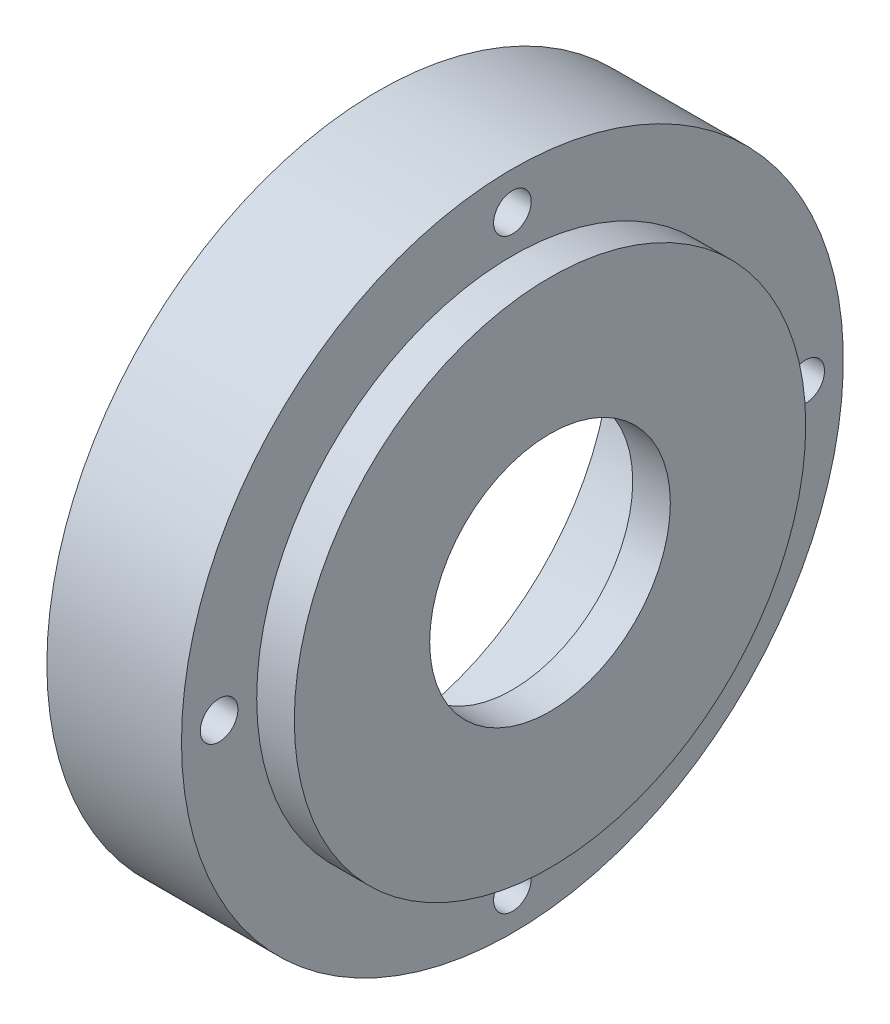
ISO-10303-21;
HEADER;
FILE_DESCRIPTION(('STEP AP214'),'2;1');
FILE_NAME('part.step','',(''),(''),'','','');
FILE_SCHEMA(('AUTOMOTIVE_DESIGN { 1 0 10303 214 1 1 1 1 }'));
ENDSEC;
DATA;
#1=APPLICATION_CONTEXT('core data for automotive mechanical design processes');
#2=APPLICATION_PROTOCOL_DEFINITION('international standard','automotive_design',2000,#1);
#3=PRODUCT_CONTEXT('',#1,'mechanical');
#4=PRODUCT('Part','Part','',(#3));
#5=PRODUCT_RELATED_PRODUCT_CATEGORY('part','',(#4));
#6=PRODUCT_DEFINITION_FORMATION('','',#4);
#7=PRODUCT_DEFINITION_CONTEXT('part definition',#1,'design');
#8=PRODUCT_DEFINITION('design','',#6,#7);
#9=PRODUCT_DEFINITION_SHAPE('','',#8);
#10=(LENGTH_UNIT() NAMED_UNIT(*) SI_UNIT(.MILLI.,.METRE.));
#11=(NAMED_UNIT(*) PLANE_ANGLE_UNIT() SI_UNIT($,.RADIAN.));
#12=(NAMED_UNIT(*) SI_UNIT($,.STERADIAN.) SOLID_ANGLE_UNIT());
#13=UNCERTAINTY_MEASURE_WITH_UNIT(LENGTH_MEASURE(1.E-05),#10,'distance_accuracy_value','');
#14=(GEOMETRIC_REPRESENTATION_CONTEXT(3) GLOBAL_UNCERTAINTY_ASSIGNED_CONTEXT((#13)) GLOBAL_UNIT_ASSIGNED_CONTEXT((#10,
#11,#12)) REPRESENTATION_CONTEXT('',''));
#15=CARTESIAN_POINT('',(0.,0.,0.));
#16=DIRECTION('',(0.,0.,1.));
#17=DIRECTION('',(1.,0.,0.));
#18=AXIS2_PLACEMENT_3D('',#15,#16,#17);
#19=CARTESIAN_POINT('',(17.9,0.,0.));
#20=DIRECTION('',(1.,0.,0.));
#21=DIRECTION('',(0.,0.,-1.));
#22=AXIS2_PLACEMENT_3D('',#19,#20,#21);
#23=PLANE('',#22);
#24=CARTESIAN_POINT('',(17.9,0.,0.));
#25=DIRECTION('',(1.,0.,0.));
#26=DIRECTION('',(0.,0.,-1.));
#27=AXIS2_PLACEMENT_3D('',#24,#25,#26);
#28=CIRCLE('',#27,34.);
#29=CARTESIAN_POINT('',(17.9,0.,-34.));
#30=VERTEX_POINT('',#29);
#31=EDGE_CURVE('E92',#30,#30,#28,.T.);
#32=ORIENTED_EDGE('',*,*,#31,.F.);
#33=EDGE_LOOP('',(#32));
#34=FACE_BOUND('',#33,.T.);
#35=CARTESIAN_POINT('',(17.9,39.,0.));
#36=DIRECTION('',(1.,0.,0.));
#37=DIRECTION('',(0.,0.,-1.));
#38=AXIS2_PLACEMENT_3D('',#35,#36,#37);
#39=CIRCLE('',#38,2.5);
#40=CARTESIAN_POINT('',(17.9,39.,-2.5));
#41=VERTEX_POINT('',#40);
#42=EDGE_CURVE('E78',#41,#41,#39,.T.);
#43=ORIENTED_EDGE('',*,*,#42,.F.);
#44=EDGE_LOOP('',(#43));
#45=FACE_BOUND('',#44,.T.);
#46=CARTESIAN_POINT('',(17.9,1.10128248401074E-12,-39.0000000000011));
#47=DIRECTION('',(1.,0.,0.));
#48=DIRECTION('',(0.,0.,-1.));
#49=AXIS2_PLACEMENT_3D('',#46,#47,#48);
#50=CIRCLE('',#49,2.50000000000086);
#51=CARTESIAN_POINT('',(17.9,1.10128248401074E-12,-41.500000000002));
#52=VERTEX_POINT('',#51);
#53=EDGE_CURVE('E70',#52,#52,#50,.T.);
#54=ORIENTED_EDGE('',*,*,#53,.F.);
#55=EDGE_LOOP('',(#54));
#56=FACE_BOUND('',#55,.T.);
#57=CARTESIAN_POINT('',(17.9,-39.,-2.20256496802149E-12));
#58=DIRECTION('',(1.,0.,0.));
#59=DIRECTION('',(0.,0.,-1.));
#60=AXIS2_PLACEMENT_3D('',#57,#58,#59);
#61=CIRCLE('',#60,2.50000000000237);
#62=CARTESIAN_POINT('',(17.9,-39.,-2.50000000000457));
#63=VERTEX_POINT('',#62);
#64=EDGE_CURVE('E60',#63,#63,#61,.T.);
#65=ORIENTED_EDGE('',*,*,#64,.F.);
#66=EDGE_LOOP('',(#65));
#67=FACE_BOUND('',#66,.T.);
#68=CARTESIAN_POINT('',(17.9,-1.10605860652742E-12,38.9999999999989));
#69=DIRECTION('',(1.,0.,0.));
#70=DIRECTION('',(0.,0.,-1.));
#71=AXIS2_PLACEMENT_3D('',#68,#69,#70);
#72=CIRCLE('',#71,2.50000000000177);
#73=CARTESIAN_POINT('',(17.9,-1.10605860652742E-12,36.4999999999971));
#74=VERTEX_POINT('',#73);
#75=EDGE_CURVE('E61',#74,#74,#72,.T.);
#76=ORIENTED_EDGE('',*,*,#75,.F.);
#77=EDGE_LOOP('',(#76));
#78=FACE_BOUND('',#77,.T.);
#79=CARTESIAN_POINT('',(17.9,0.,0.));
#80=DIRECTION('',(1.,0.,0.));
#81=DIRECTION('',(0.,0.,-1.));
#82=AXIS2_PLACEMENT_3D('',#79,#80,#81);
#83=CIRCLE('',#82,44.);
#84=CARTESIAN_POINT('',(17.9,0.,44.));
#85=VERTEX_POINT('',#84);
#86=EDGE_CURVE('E10',#85,#85,#83,.T.);
#87=ORIENTED_EDGE('',*,*,#86,.T.);
#88=EDGE_LOOP('',(#87));
#89=FACE_BOUND('',#88,.T.);
#90=ADVANCED_FACE('F37',(#34,#45,#56,#67,#78,#89),#23,.T.);
#91=CARTESIAN_POINT('',(0.,0.,0.));
#92=DIRECTION('',(1.,0.,0.));
#93=DIRECTION('',(0.,0.,-1.));
#94=AXIS2_PLACEMENT_3D('',#91,#92,#93);
#95=PLANE('',#94);
#96=CARTESIAN_POINT('',(0.,39.,0.));
#97=DIRECTION('',(1.,0.,0.));
#98=DIRECTION('',(0.,0.,-1.));
#99=AXIS2_PLACEMENT_3D('',#96,#97,#98);
#100=CIRCLE('',#99,2.5);
#101=CARTESIAN_POINT('',(0.,39.,-2.5));
#102=VERTEX_POINT('',#101);
#103=EDGE_CURVE('E55',#102,#102,#100,.F.);
#104=ORIENTED_EDGE('',*,*,#103,.F.);
#105=EDGE_LOOP('',(#104));
#106=FACE_BOUND('',#105,.T.);
#107=CARTESIAN_POINT('',(0.,1.10128248401074E-12,-39.0000000000011));
#108=DIRECTION('',(1.,0.,0.));
#109=DIRECTION('',(0.,0.,-1.));
#110=AXIS2_PLACEMENT_3D('',#107,#108,#109);
#111=CIRCLE('',#110,2.50000000000086);
#112=CARTESIAN_POINT('',(0.,1.10128248401074E-12,-41.500000000002));
#113=VERTEX_POINT('',#112);
#114=EDGE_CURVE('E74',#113,#113,#111,.F.);
#115=ORIENTED_EDGE('',*,*,#114,.F.);
#116=EDGE_LOOP('',(#115));
#117=FACE_BOUND('',#116,.T.);
#118=CARTESIAN_POINT('',(0.,-39.,-2.20256496802149E-12));
#119=DIRECTION('',(1.,0.,0.));
#120=DIRECTION('',(0.,0.,-1.));
#121=AXIS2_PLACEMENT_3D('',#118,#119,#120);
#122=CIRCLE('',#121,2.50000000000237);
#123=CARTESIAN_POINT('',(0.,-39.,-2.50000000000457));
#124=VERTEX_POINT('',#123);
#125=EDGE_CURVE('E66',#124,#124,#122,.F.);
#126=ORIENTED_EDGE('',*,*,#125,.F.);
#127=EDGE_LOOP('',(#126));
#128=FACE_BOUND('',#127,.T.);
#129=CARTESIAN_POINT('',(0.,-1.10605860652742E-12,38.9999999999989));
#130=DIRECTION('',(1.,0.,0.));
#131=DIRECTION('',(0.,0.,-1.));
#132=AXIS2_PLACEMENT_3D('',#129,#130,#131);
#133=CIRCLE('',#132,2.50000000000177);
#134=CARTESIAN_POINT('',(0.,-1.10605860652742E-12,36.4999999999971));
#135=VERTEX_POINT('',#134);
#136=EDGE_CURVE('E56',#135,#135,#133,.F.);
#137=ORIENTED_EDGE('',*,*,#136,.F.);
#138=EDGE_LOOP('',(#137));
#139=FACE_BOUND('',#138,.T.);
#140=CARTESIAN_POINT('',(0.,0.,0.));
#141=DIRECTION('',(1.,0.,0.));
#142=DIRECTION('',(0.,0.,-1.));
#143=AXIS2_PLACEMENT_3D('',#140,#141,#142);
#144=CIRCLE('',#143,44.);
#145=CARTESIAN_POINT('',(0.,0.,44.));
#146=VERTEX_POINT('',#145);
#147=EDGE_CURVE('E41',#146,#146,#144,.T.);
#148=ORIENTED_EDGE('',*,*,#147,.F.);
#149=EDGE_LOOP('',(#148));
#150=FACE_BOUND('',#149,.T.);
#151=CARTESIAN_POINT('',(0.,0.,0.));
#152=DIRECTION('',(1.,0.,0.));
#153=DIRECTION('',(0.,0.,-1.));
#154=AXIS2_PLACEMENT_3D('',#151,#152,#153);
#155=CIRCLE('',#154,31.);
#156=CARTESIAN_POINT('',(0.,0.,31.));
#157=VERTEX_POINT('',#156);
#158=EDGE_CURVE('E50',#157,#157,#155,.T.);
#159=ORIENTED_EDGE('',*,*,#158,.T.);
#160=EDGE_LOOP('',(#159));
#161=FACE_BOUND('',#160,.T.);
#162=ADVANCED_FACE('F128',(#106,#117,#128,#139,#150,#161),#95,.F.);
#163=CARTESIAN_POINT('',(17.9,0.,0.));
#164=DIRECTION('',(-1.,0.,0.));
#165=DIRECTION('',(0.,0.,1.));
#166=AXIS2_PLACEMENT_3D('',#163,#164,#165);
#167=CYLINDRICAL_SURFACE('',#166,44.);
#168=CARTESIAN_POINT('',(17.9,0.,44.));
#169=CARTESIAN_POINT('',(17.7135416666667,0.,44.));
#170=CARTESIAN_POINT('',(17.5270833333333,0.,44.));
#171=CARTESIAN_POINT('',(17.1541666666667,0.,44.));
#172=CARTESIAN_POINT('',(16.9677083333333,0.,44.));
#173=CARTESIAN_POINT('',(16.5947916666667,0.,44.));
#174=CARTESIAN_POINT('',(16.4083333333333,0.,44.));
#175=CARTESIAN_POINT('',(16.0354166666667,0.,44.));
#176=CARTESIAN_POINT('',(15.8489583333333,0.,44.));
#177=CARTESIAN_POINT('',(15.4760416666667,0.,44.));
#178=CARTESIAN_POINT('',(15.2895833333333,0.,44.));
#179=CARTESIAN_POINT('',(14.9166666666667,0.,44.));
#180=CARTESIAN_POINT('',(14.7302083333333,0.,44.));
#181=CARTESIAN_POINT('',(14.3572916666667,0.,44.));
#182=CARTESIAN_POINT('',(14.1708333333333,0.,44.));
#183=CARTESIAN_POINT('',(13.7979166666667,0.,44.));
#184=CARTESIAN_POINT('',(13.6114583333333,0.,44.));
#185=CARTESIAN_POINT('',(13.2385416666667,0.,44.));
#186=CARTESIAN_POINT('',(13.0520833333333,0.,44.));
#187=CARTESIAN_POINT('',(12.6791666666667,0.,44.));
#188=CARTESIAN_POINT('',(12.4927083333333,0.,44.));
#189=CARTESIAN_POINT('',(12.1197916666667,0.,44.));
#190=CARTESIAN_POINT('',(11.9333333333333,0.,44.));
#191=CARTESIAN_POINT('',(11.5604166666667,0.,44.));
#192=CARTESIAN_POINT('',(11.3739583333333,0.,44.));
#193=CARTESIAN_POINT('',(11.0010416666667,0.,44.));
#194=CARTESIAN_POINT('',(10.8145833333333,0.,44.));
#195=CARTESIAN_POINT('',(10.4416666666667,0.,44.));
#196=CARTESIAN_POINT('',(10.2552083333333,0.,44.));
#197=CARTESIAN_POINT('',(9.88229166666666,0.,44.));
#198=CARTESIAN_POINT('',(9.69583333333333,0.,44.));
#199=CARTESIAN_POINT('',(9.32291666666666,0.,44.));
#200=CARTESIAN_POINT('',(9.13645833333333,0.,44.));
#201=CARTESIAN_POINT('',(8.76354166666667,0.,44.));
#202=CARTESIAN_POINT('',(8.57708333333333,0.,44.));
#203=CARTESIAN_POINT('',(8.20416666666666,0.,44.));
#204=CARTESIAN_POINT('',(8.01770833333333,0.,44.));
#205=CARTESIAN_POINT('',(7.64479166666666,0.,44.));
#206=CARTESIAN_POINT('',(7.45833333333333,0.,44.));
#207=CARTESIAN_POINT('',(7.08541666666666,0.,44.));
#208=CARTESIAN_POINT('',(6.89895833333333,0.,44.));
#209=CARTESIAN_POINT('',(6.52604166666666,0.,44.));
#210=CARTESIAN_POINT('',(6.33958333333333,0.,44.));
#211=CARTESIAN_POINT('',(5.96666666666666,0.,44.));
#212=CARTESIAN_POINT('',(5.78020833333333,0.,44.));
#213=CARTESIAN_POINT('',(5.40729166666666,0.,44.));
#214=CARTESIAN_POINT('',(5.22083333333333,0.,44.));
#215=CARTESIAN_POINT('',(4.84791666666666,0.,44.));
#216=CARTESIAN_POINT('',(4.66145833333333,0.,44.));
#217=CARTESIAN_POINT('',(4.28854166666666,0.,44.));
#218=CARTESIAN_POINT('',(4.10208333333333,0.,44.));
#219=CARTESIAN_POINT('',(3.72916666666666,0.,44.));
#220=CARTESIAN_POINT('',(3.54270833333333,0.,44.));
#221=CARTESIAN_POINT('',(3.16979166666666,0.,44.));
#222=CARTESIAN_POINT('',(2.98333333333333,0.,44.));
#223=CARTESIAN_POINT('',(2.61041666666666,0.,44.));
#224=CARTESIAN_POINT('',(2.42395833333333,0.,44.));
#225=CARTESIAN_POINT('',(2.05104166666666,0.,44.));
#226=CARTESIAN_POINT('',(1.86458333333333,0.,44.));
#227=CARTESIAN_POINT('',(1.49166666666666,0.,44.));
#228=CARTESIAN_POINT('',(1.30520833333333,0.,44.));
#229=CARTESIAN_POINT('',(0.932291666666665,0.,44.));
#230=CARTESIAN_POINT('',(0.745833333333331,0.,44.));
#231=CARTESIAN_POINT('',(0.372916666666664,0.,44.));
#232=CARTESIAN_POINT('',(0.18645833333333,0.,44.));
#233=CARTESIAN_POINT('',(0.,0.,44.));
#234=B_SPLINE_CURVE_WITH_KNOTS('',3,(#168,#169,#170,#171,#172,#173,#174,#175,#176,#177,#178,
#179,#180,#181,#182,#183,#184,#185,#186,#187,#188,#189,#190,#191,#192,#193,#194,#195,#196,#197,
#198,#199,#200,#201,#202,#203,#204,#205,#206,#207,#208,#209,#210,#211,#212,#213,#214,#215,#216,
#217,#218,#219,#220,#221,#222,#223,#224,#225,#226,#227,#228,#229,#230,#231,#232,#233),
.UNSPECIFIED.,.F.,.F.,(4,2,2,2,2,2,2,2,2,2,2,2,2,2,2,2,2,2,2,2,2,2,2,2,2,2,2,2,2,2,2,2,4),(0.,
0.559374999999997,1.11875,1.678125,2.2375,2.796875,3.35625,3.915625,4.475,5.034375,5.59375,
6.153125,6.7125,7.271875,7.83125,8.390625,8.95,9.509375,10.06875,10.628125,11.1875,11.746875,
12.30625,12.865625,13.425,13.984375,14.54375,15.103125,15.6625,16.221875,16.78125,17.340625,
17.9),.UNSPECIFIED.);
#235=EDGE_CURVE('BSEAM39',#85,#146,#234,.T.);
#236=ORIENTED_EDGE('',*,*,#86,.F.);
#237=ORIENTED_EDGE('',*,*,#147,.T.);
#238=ORIENTED_EDGE('',*,*,#235,.T.);
#239=ORIENTED_EDGE('',*,*,#235,.F.);
#240=EDGE_LOOP('',(#236,#238,#237,#239));
#241=FACE_BOUND('',#240,.T.);
#242=ADVANCED_FACE('F39',(#241),#167,.T.);
#243=CARTESIAN_POINT('',(17.9,0.,0.));
#244=DIRECTION('',(-1.,0.,0.));
#245=DIRECTION('',(0.,0.,1.));
#246=AXIS2_PLACEMENT_3D('',#243,#244,#245);
#247=CYLINDRICAL_SURFACE('',#246,31.);
#248=CARTESIAN_POINT('',(17.9,0.,0.));
#249=DIRECTION('',(1.,0.,0.));
#250=DIRECTION('',(0.,0.,-1.));
#251=AXIS2_PLACEMENT_3D('',#248,#249,#250);
#252=CIRCLE('',#251,31.);
#253=CARTESIAN_POINT('',(17.9,0.,31.));
#254=VERTEX_POINT('',#253);
#255=EDGE_CURVE('E65',#254,#254,#252,.T.);
#256=CARTESIAN_POINT('',(17.9,0.,31.));
#257=CARTESIAN_POINT('',(17.7135416666667,0.,31.));
#258=CARTESIAN_POINT('',(17.5270833333333,0.,31.));
#259=CARTESIAN_POINT('',(17.1541666666667,0.,31.));
#260=CARTESIAN_POINT('',(16.9677083333333,0.,31.));
#261=CARTESIAN_POINT('',(16.5947916666667,0.,31.));
#262=CARTESIAN_POINT('',(16.4083333333333,0.,31.));
#263=CARTESIAN_POINT('',(16.0354166666667,0.,31.));
#264=CARTESIAN_POINT('',(15.8489583333333,0.,31.));
#265=CARTESIAN_POINT('',(15.4760416666667,0.,31.));
#266=CARTESIAN_POINT('',(15.2895833333333,0.,31.));
#267=CARTESIAN_POINT('',(14.9166666666667,0.,31.));
#268=CARTESIAN_POINT('',(14.7302083333333,0.,31.));
#269=CARTESIAN_POINT('',(14.3572916666667,0.,31.));
#270=CARTESIAN_POINT('',(14.1708333333333,0.,31.));
#271=CARTESIAN_POINT('',(13.7979166666667,0.,31.));
#272=CARTESIAN_POINT('',(13.6114583333333,0.,31.));
#273=CARTESIAN_POINT('',(13.2385416666667,0.,31.));
#274=CARTESIAN_POINT('',(13.0520833333333,0.,31.));
#275=CARTESIAN_POINT('',(12.6791666666667,0.,31.));
#276=CARTESIAN_POINT('',(12.4927083333333,0.,31.));
#277=CARTESIAN_POINT('',(12.1197916666667,0.,31.));
#278=CARTESIAN_POINT('',(11.9333333333333,0.,31.));
#279=CARTESIAN_POINT('',(11.5604166666667,0.,31.));
#280=CARTESIAN_POINT('',(11.3739583333333,0.,31.));
#281=CARTESIAN_POINT('',(11.0010416666667,0.,31.));
#282=CARTESIAN_POINT('',(10.8145833333333,0.,31.));
#283=CARTESIAN_POINT('',(10.4416666666667,0.,31.));
#284=CARTESIAN_POINT('',(10.2552083333333,0.,31.));
#285=CARTESIAN_POINT('',(9.88229166666666,0.,31.));
#286=CARTESIAN_POINT('',(9.69583333333333,0.,31.));
#287=CARTESIAN_POINT('',(9.32291666666666,0.,31.));
#288=CARTESIAN_POINT('',(9.13645833333333,0.,31.));
#289=CARTESIAN_POINT('',(8.76354166666667,0.,31.));
#290=CARTESIAN_POINT('',(8.57708333333333,0.,31.));
#291=CARTESIAN_POINT('',(8.20416666666666,0.,31.));
#292=CARTESIAN_POINT('',(8.01770833333333,0.,31.));
#293=CARTESIAN_POINT('',(7.64479166666666,0.,31.));
#294=CARTESIAN_POINT('',(7.45833333333333,0.,31.));
#295=CARTESIAN_POINT('',(7.08541666666666,0.,31.));
#296=CARTESIAN_POINT('',(6.89895833333333,0.,31.));
#297=CARTESIAN_POINT('',(6.52604166666666,0.,31.));
#298=CARTESIAN_POINT('',(6.33958333333333,0.,31.));
#299=CARTESIAN_POINT('',(5.96666666666666,0.,31.));
#300=CARTESIAN_POINT('',(5.78020833333333,0.,31.));
#301=CARTESIAN_POINT('',(5.40729166666666,0.,31.));
#302=CARTESIAN_POINT('',(5.22083333333333,0.,31.));
#303=CARTESIAN_POINT('',(4.84791666666666,0.,31.));
#304=CARTESIAN_POINT('',(4.66145833333333,0.,31.));
#305=CARTESIAN_POINT('',(4.28854166666666,0.,31.));
#306=CARTESIAN_POINT('',(4.10208333333333,0.,31.));
#307=CARTESIAN_POINT('',(3.72916666666666,0.,31.));
#308=CARTESIAN_POINT('',(3.54270833333333,0.,31.));
#309=CARTESIAN_POINT('',(3.16979166666666,0.,31.));
#310=CARTESIAN_POINT('',(2.98333333333333,0.,31.));
#311=CARTESIAN_POINT('',(2.61041666666666,0.,31.));
#312=CARTESIAN_POINT('',(2.42395833333333,0.,31.));
#313=CARTESIAN_POINT('',(2.05104166666666,0.,31.));
#314=CARTESIAN_POINT('',(1.86458333333333,0.,31.));
#315=CARTESIAN_POINT('',(1.49166666666666,0.,31.));
#316=CARTESIAN_POINT('',(1.30520833333333,0.,31.));
#317=CARTESIAN_POINT('',(0.932291666666665,0.,31.));
#318=CARTESIAN_POINT('',(0.745833333333331,0.,31.));
#319=CARTESIAN_POINT('',(0.372916666666664,0.,31.));
#320=CARTESIAN_POINT('',(0.18645833333333,0.,31.));
#321=CARTESIAN_POINT('',(0.,0.,31.));
#322=B_SPLINE_CURVE_WITH_KNOTS('',3,(#256,#257,#258,#259,#260,#261,#262,#263,#264,#265,#266,
#267,#268,#269,#270,#271,#272,#273,#274,#275,#276,#277,#278,#279,#280,#281,#282,#283,#284,#285,
#286,#287,#288,#289,#290,#291,#292,#293,#294,#295,#296,#297,#298,#299,#300,#301,#302,#303,#304,
#305,#306,#307,#308,#309,#310,#311,#312,#313,#314,#315,#316,#317,#318,#319,#320,#321),
.UNSPECIFIED.,.F.,.F.,(4,2,2,2,2,2,2,2,2,2,2,2,2,2,2,2,2,2,2,2,2,2,2,2,2,2,2,2,2,2,2,2,4),(0.,
0.559374999999997,1.11875,1.678125,2.2375,2.796875,3.35625,3.915625,4.475,5.034375,5.59375,
6.153125,6.7125,7.271875,7.83125,8.390625,8.95,9.509375,10.06875,10.628125,11.1875,11.746875,
12.30625,12.865625,13.425,13.984375,14.54375,15.103125,15.6625,16.221875,16.78125,17.340625,
17.9),.UNSPECIFIED.);
#323=EDGE_CURVE('BSEAM140',#254,#157,#322,.T.);
#324=ORIENTED_EDGE('',*,*,#255,.T.);
#325=ORIENTED_EDGE('',*,*,#158,.F.);
#326=ORIENTED_EDGE('',*,*,#323,.T.);
#327=ORIENTED_EDGE('',*,*,#323,.F.);
#328=EDGE_LOOP('',(#324,#326,#325,#327));
#329=FACE_BOUND('',#328,.T.);
#330=ADVANCED_FACE('F140',(#329),#247,.F.);
#331=CARTESIAN_POINT('',(-7.07106781187217,-1.10605860652742E-12,38.9999999999989));
#332=DIRECTION('',(1.,0.,0.));
#333=DIRECTION('',(0.,0.,-1.));
#334=AXIS2_PLACEMENT_3D('',#331,#332,#333);
#335=CYLINDRICAL_SURFACE('',#334,2.50000000000177);
#336=ORIENTED_EDGE('',*,*,#136,.T.);
#337=EDGE_LOOP('',(#336));
#338=FACE_BOUND('',#337,.T.);
#339=ORIENTED_EDGE('',*,*,#75,.T.);
#340=EDGE_LOOP('',(#339));
#341=FACE_BOUND('',#340,.T.);
#342=ADVANCED_FACE('F143',(#338,#341),#335,.F.);
#343=CARTESIAN_POINT('',(-7.07106781187217,-39.,-2.20256496802149E-12));
#344=DIRECTION('',(1.,0.,0.));
#345=DIRECTION('',(0.,0.,-1.));
#346=AXIS2_PLACEMENT_3D('',#343,#344,#345);
#347=CYLINDRICAL_SURFACE('',#346,2.50000000000237);
#348=ORIENTED_EDGE('',*,*,#125,.T.);
#349=EDGE_LOOP('',(#348));
#350=FACE_BOUND('',#349,.T.);
#351=ORIENTED_EDGE('',*,*,#64,.T.);
#352=EDGE_LOOP('',(#351));
#353=FACE_BOUND('',#352,.T.);
#354=ADVANCED_FACE('F147',(#350,#353),#347,.F.);
#355=CARTESIAN_POINT('',(-7.07106781187217,1.10128248401074E-12,-39.0000000000011));
#356=DIRECTION('',(1.,0.,0.));
#357=DIRECTION('',(0.,0.,-1.));
#358=AXIS2_PLACEMENT_3D('',#355,#356,#357);
#359=CYLINDRICAL_SURFACE('',#358,2.50000000000086);
#360=ORIENTED_EDGE('',*,*,#114,.T.);
#361=EDGE_LOOP('',(#360));
#362=FACE_BOUND('',#361,.T.);
#363=ORIENTED_EDGE('',*,*,#53,.T.);
#364=EDGE_LOOP('',(#363));
#365=FACE_BOUND('',#364,.T.);
#366=ADVANCED_FACE('F151',(#362,#365),#359,.F.);
#367=CARTESIAN_POINT('',(-7.07106781187217,39.,0.));
#368=DIRECTION('',(1.,0.,0.));
#369=DIRECTION('',(0.,0.,-1.));
#370=AXIS2_PLACEMENT_3D('',#367,#368,#369);
#371=CYLINDRICAL_SURFACE('',#370,2.5);
#372=ORIENTED_EDGE('',*,*,#103,.T.);
#373=EDGE_LOOP('',(#372));
#374=FACE_BOUND('',#373,.T.);
#375=ORIENTED_EDGE('',*,*,#42,.T.);
#376=EDGE_LOOP('',(#375));
#377=FACE_BOUND('',#376,.T.);
#378=ADVANCED_FACE('F123',(#374,#377),#371,.F.);
#379=CARTESIAN_POINT('',(17.9,0.,0.));
#380=DIRECTION('',(1.,0.,0.));
#381=DIRECTION('',(0.,0.,-1.));
#382=AXIS2_PLACEMENT_3D('',#379,#380,#381);
#383=PLANE('',#382);
#384=CARTESIAN_POINT('',(17.9,0.,0.));
#385=DIRECTION('',(1.,0.,0.));
#386=DIRECTION('',(0.,0.,-1.));
#387=AXIS2_PLACEMENT_3D('',#384,#385,#386);
#388=CIRCLE('',#387,16.);
#389=CARTESIAN_POINT('',(17.9,0.,-16.));
#390=VERTEX_POINT('',#389);
#391=EDGE_CURVE('E100',#390,#390,#388,.T.);
#392=ORIENTED_EDGE('',*,*,#391,.T.);
#393=EDGE_LOOP('',(#392));
#394=FACE_BOUND('',#393,.T.);
#395=ORIENTED_EDGE('',*,*,#255,.F.);
#396=EDGE_LOOP('',(#395));
#397=FACE_BOUND('',#396,.T.);
#398=ADVANCED_FACE('F114',(#394,#397),#383,.F.);
#399=CARTESIAN_POINT('',(22.9,0.,0.));
#400=DIRECTION('',(1.,0.,0.));
#401=DIRECTION('',(0.,0.,-1.));
#402=AXIS2_PLACEMENT_3D('',#399,#400,#401);
#403=PLANE('',#402);
#404=CARTESIAN_POINT('',(22.9,0.,0.));
#405=DIRECTION('',(1.,0.,0.));
#406=DIRECTION('',(0.,0.,-1.));
#407=AXIS2_PLACEMENT_3D('',#404,#405,#406);
#408=CIRCLE('',#407,34.);
#409=CARTESIAN_POINT('',(22.9,0.,-34.));
#410=VERTEX_POINT('',#409);
#411=EDGE_CURVE('E91',#410,#410,#408,.T.);
#412=ORIENTED_EDGE('',*,*,#411,.T.);
#413=EDGE_LOOP('',(#412));
#414=FACE_BOUND('',#413,.T.);
#415=CARTESIAN_POINT('',(22.9,0.,0.));
#416=DIRECTION('',(1.,0.,0.));
#417=DIRECTION('',(0.,0.,-1.));
#418=AXIS2_PLACEMENT_3D('',#415,#416,#417);
#419=CIRCLE('',#418,16.);
#420=CARTESIAN_POINT('',(22.9,0.,-16.));
#421=VERTEX_POINT('',#420);
#422=EDGE_CURVE('E96',#421,#421,#419,.T.);
#423=ORIENTED_EDGE('',*,*,#422,.F.);
#424=EDGE_LOOP('',(#423));
#425=FACE_BOUND('',#424,.T.);
#426=ADVANCED_FACE('F111',(#414,#425),#403,.T.);
#427=CARTESIAN_POINT('',(22.9,0.,0.));
#428=DIRECTION('',(-1.,0.,0.));
#429=DIRECTION('',(0.,0.,1.));
#430=AXIS2_PLACEMENT_3D('',#427,#428,#429);
#431=CYLINDRICAL_SURFACE('',#430,34.);
#432=ORIENTED_EDGE('',*,*,#411,.F.);
#433=EDGE_LOOP('',(#432));
#434=FACE_BOUND('',#433,.T.);
#435=ORIENTED_EDGE('',*,*,#31,.T.);
#436=EDGE_LOOP('',(#435));
#437=FACE_BOUND('',#436,.T.);
#438=ADVANCED_FACE('F113',(#434,#437),#431,.T.);
#439=CARTESIAN_POINT('',(22.9,0.,0.));
#440=DIRECTION('',(-1.,0.,0.));
#441=DIRECTION('',(0.,0.,1.));
#442=AXIS2_PLACEMENT_3D('',#439,#440,#441);
#443=CYLINDRICAL_SURFACE('',#442,16.);
#444=ORIENTED_EDGE('',*,*,#422,.T.);
#445=EDGE_LOOP('',(#444));
#446=FACE_BOUND('',#445,.T.);
#447=ORIENTED_EDGE('',*,*,#391,.F.);
#448=EDGE_LOOP('',(#447));
#449=FACE_BOUND('',#448,.T.);
#450=ADVANCED_FACE('F108',(#446,#449),#443,.F.);
#451=CLOSED_SHELL('',(#90,#162,#242,#330,#342,#354,#366,#378,#398,#426,#438,#450));
#452=MANIFOLD_SOLID_BREP('B2',#451);
#453=ADVANCED_BREP_SHAPE_REPRESENTATION('',(#18,#452),#14);
#454=SHAPE_DEFINITION_REPRESENTATION(#9,#453);
ENDSEC;
END-ISO-10303-21;
